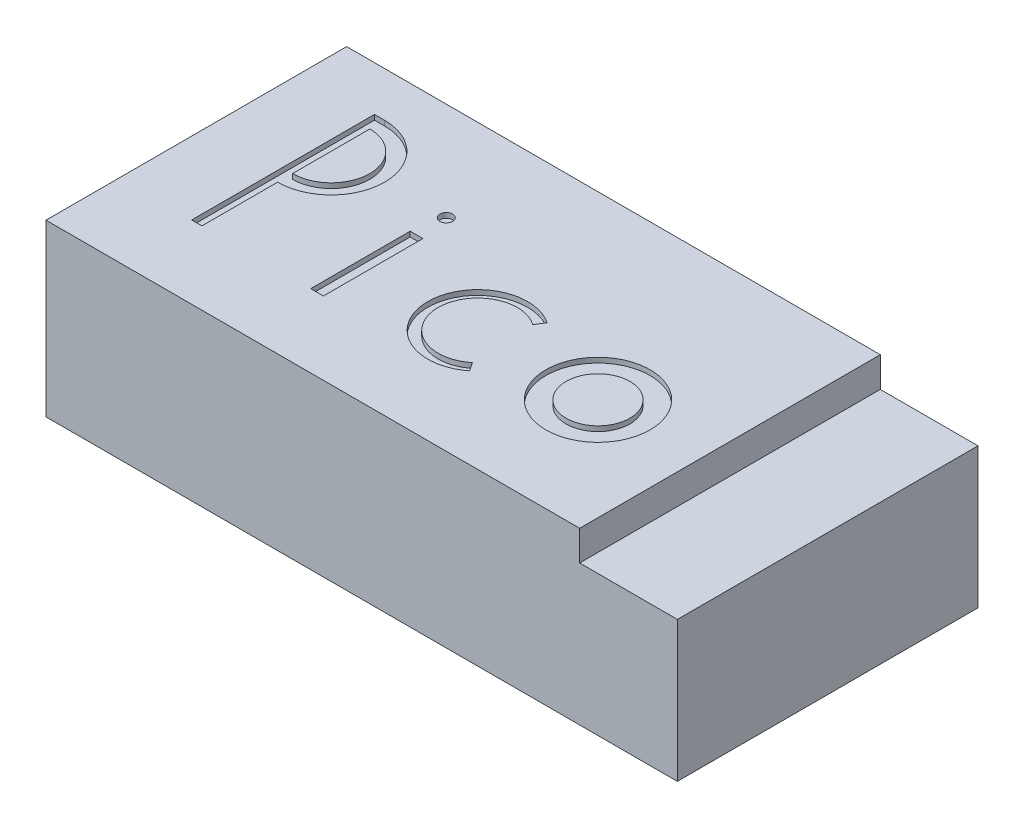
ISO-10303-21;
HEADER;
FILE_DESCRIPTION(('STEP AP214'),'2;1');
FILE_NAME('part.step','',(''),(''),'','','');
FILE_SCHEMA(('AUTOMOTIVE_DESIGN { 1 0 10303 214 1 1 1 1 }'));
ENDSEC;
DATA;
#1=APPLICATION_CONTEXT('core data for automotive mechanical design processes');
#2=APPLICATION_PROTOCOL_DEFINITION('international standard','automotive_design',2000,#1);
#3=PRODUCT_CONTEXT('',#1,'mechanical');
#4=PRODUCT('Part','Part','',(#3));
#5=PRODUCT_RELATED_PRODUCT_CATEGORY('part','',(#4));
#6=PRODUCT_DEFINITION_FORMATION('','',#4);
#7=PRODUCT_DEFINITION_CONTEXT('part definition',#1,'design');
#8=PRODUCT_DEFINITION('design','',#6,#7);
#9=PRODUCT_DEFINITION_SHAPE('','',#8);
#10=(LENGTH_UNIT() NAMED_UNIT(*) SI_UNIT(.MILLI.,.METRE.));
#11=(NAMED_UNIT(*) PLANE_ANGLE_UNIT() SI_UNIT($,.RADIAN.));
#12=(NAMED_UNIT(*) SI_UNIT($,.STERADIAN.) SOLID_ANGLE_UNIT());
#13=UNCERTAINTY_MEASURE_WITH_UNIT(LENGTH_MEASURE(1.E-05),#10,'distance_accuracy_value','');
#14=(GEOMETRIC_REPRESENTATION_CONTEXT(3) GLOBAL_UNCERTAINTY_ASSIGNED_CONTEXT((#13)) GLOBAL_UNIT_ASSIGNED_CONTEXT((#10,
#11,#12)) REPRESENTATION_CONTEXT('',''));
#15=CARTESIAN_POINT('',(0.,0.,0.));
#16=DIRECTION('',(0.,0.,1.));
#17=DIRECTION('',(1.,0.,0.));
#18=AXIS2_PLACEMENT_3D('',#15,#16,#17);
#19=CARTESIAN_POINT('',(0.,28.,-60.));
#20=DIRECTION('',(1.,0.,0.));
#21=DIRECTION('',(0.,0.,-1.));
#22=AXIS2_PLACEMENT_3D('',#19,#20,#21);
#23=PLANE('',#22);
#24=DIRECTION('',(0.,0.,1.));
#25=VECTOR('',#24,1.);
#26=CARTESIAN_POINT('',(0.,0.,-60.));
#27=LINE('',#26,#25);
#28=CARTESIAN_POINT('',(0.,0.,-60.));
#29=VERTEX_POINT('',#28);
#30=CARTESIAN_POINT('',(0.,0.,0.));
#31=VERTEX_POINT('',#30);
#32=EDGE_CURVE('E405',#29,#31,#27,.T.);
#33=ORIENTED_EDGE('',*,*,#32,.T.);
#34=DIRECTION('',(0.,-1.,0.));
#35=VECTOR('',#34,1.);
#36=CARTESIAN_POINT('',(0.,28.,0.));
#37=LINE('',#36,#35);
#38=CARTESIAN_POINT('',(0.,34.,0.));
#39=VERTEX_POINT('',#38);
#40=EDGE_CURVE('E11',#39,#31,#37,.T.);
#41=ORIENTED_EDGE('',*,*,#40,.F.);
#42=DIRECTION('',(0.,0.,1.));
#43=VECTOR('',#42,1.);
#44=CARTESIAN_POINT('',(0.,34.,-60.));
#45=LINE('',#44,#43);
#46=CARTESIAN_POINT('',(0.,34.,-60.));
#47=VERTEX_POINT('',#46);
#48=EDGE_CURVE('E380',#47,#39,#45,.T.);
#49=ORIENTED_EDGE('',*,*,#48,.F.);
#50=DIRECTION('',(0.,-1.,0.));
#51=VECTOR('',#50,1.);
#52=CARTESIAN_POINT('',(0.,28.,-60.));
#53=LINE('',#52,#51);
#54=EDGE_CURVE('E416',#47,#29,#53,.T.);
#55=ORIENTED_EDGE('',*,*,#54,.T.);
#56=EDGE_LOOP('',(#33,#41,#49,#55));
#57=FACE_BOUND('',#56,.T.);
#58=ADVANCED_FACE('F45',(#57),#23,.F.);
#59=CARTESIAN_POINT('',(0.,28.,0.));
#60=DIRECTION('',(0.,0.,-1.));
#61=DIRECTION('',(-1.,0.,0.));
#62=AXIS2_PLACEMENT_3D('',#59,#60,#61);
#63=PLANE('',#62);
#64=DIRECTION('',(1.,0.,0.));
#65=VECTOR('',#64,1.);
#66=CARTESIAN_POINT('',(0.,0.,0.));
#67=LINE('',#66,#65);
#68=CARTESIAN_POINT('',(126.,0.,0.));
#69=VERTEX_POINT('',#68);
#70=EDGE_CURVE('E420',#31,#69,#67,.T.);
#71=ORIENTED_EDGE('',*,*,#70,.T.);
#72=DIRECTION('',(0.,-1.,0.));
#73=VECTOR('',#72,1.);
#74=CARTESIAN_POINT('',(126.,28.,0.));
#75=LINE('',#74,#73);
#76=CARTESIAN_POINT('',(126.,28.,0.));
#77=VERTEX_POINT('',#76);
#78=EDGE_CURVE('E53',#77,#69,#75,.T.);
#79=ORIENTED_EDGE('',*,*,#78,.F.);
#80=DIRECTION('',(1.,0.,0.));
#81=VECTOR('',#80,1.);
#82=CARTESIAN_POINT('',(0.,28.,0.));
#83=LINE('',#82,#81);
#84=CARTESIAN_POINT('',(106.5,28.,0.));
#85=VERTEX_POINT('',#84);
#86=EDGE_CURVE('E406',#85,#77,#83,.T.);
#87=ORIENTED_EDGE('',*,*,#86,.F.);
#88=DIRECTION('',(0.,-1.,0.));
#89=VECTOR('',#88,1.);
#90=CARTESIAN_POINT('',(106.5,34.,0.));
#91=LINE('',#90,#89);
#92=CARTESIAN_POINT('',(106.5,34.,0.));
#93=VERTEX_POINT('',#92);
#94=EDGE_CURVE('E401',#93,#85,#91,.T.);
#95=ORIENTED_EDGE('',*,*,#94,.F.);
#96=DIRECTION('',(1.,0.,0.));
#97=VECTOR('',#96,1.);
#98=CARTESIAN_POINT('',(0.,34.,0.));
#99=LINE('',#98,#97);
#100=EDGE_CURVE('E384',#39,#93,#99,.T.);
#101=ORIENTED_EDGE('',*,*,#100,.F.);
#102=ORIENTED_EDGE('',*,*,#40,.T.);
#103=EDGE_LOOP('',(#71,#79,#87,#95,#101,#102));
#104=FACE_BOUND('',#103,.T.);
#105=ADVANCED_FACE('F464',(#104),#63,.F.);
#106=CARTESIAN_POINT('',(126.,28.,0.));
#107=DIRECTION('',(-1.,0.,0.));
#108=DIRECTION('',(0.,0.,1.));
#109=AXIS2_PLACEMENT_3D('',#106,#107,#108);
#110=PLANE('',#109);
#111=DIRECTION('',(0.,0.,-1.));
#112=VECTOR('',#111,1.);
#113=CARTESIAN_POINT('',(126.,0.,0.));
#114=LINE('',#113,#112);
#115=CARTESIAN_POINT('',(126.,0.,-60.));
#116=VERTEX_POINT('',#115);
#117=EDGE_CURVE('E423',#69,#116,#114,.T.);
#118=ORIENTED_EDGE('',*,*,#117,.T.);
#119=DIRECTION('',(0.,-1.,0.));
#120=VECTOR('',#119,1.);
#121=CARTESIAN_POINT('',(126.,28.,-60.));
#122=LINE('',#121,#120);
#123=CARTESIAN_POINT('',(126.,28.,-60.));
#124=VERTEX_POINT('',#123);
#125=EDGE_CURVE('E431',#124,#116,#122,.T.);
#126=ORIENTED_EDGE('',*,*,#125,.F.);
#127=DIRECTION('',(0.,0.,-1.));
#128=VECTOR('',#127,1.);
#129=CARTESIAN_POINT('',(126.,28.,0.));
#130=LINE('',#129,#128);
#131=EDGE_CURVE('E409',#77,#124,#130,.T.);
#132=ORIENTED_EDGE('',*,*,#131,.F.);
#133=ORIENTED_EDGE('',*,*,#78,.T.);
#134=EDGE_LOOP('',(#118,#126,#132,#133));
#135=FACE_BOUND('',#134,.T.);
#136=ADVANCED_FACE('F440',(#135),#110,.F.);
#137=CARTESIAN_POINT('',(126.,28.,-60.));
#138=DIRECTION('',(0.,0.,1.));
#139=DIRECTION('',(1.,0.,0.));
#140=AXIS2_PLACEMENT_3D('',#137,#138,#139);
#141=PLANE('',#140);
#142=DIRECTION('',(-1.,0.,0.));
#143=VECTOR('',#142,1.);
#144=CARTESIAN_POINT('',(126.,0.,-60.));
#145=LINE('',#144,#143);
#146=EDGE_CURVE('E410',#116,#29,#145,.T.);
#147=ORIENTED_EDGE('',*,*,#146,.T.);
#148=ORIENTED_EDGE('',*,*,#54,.F.);
#149=DIRECTION('',(-1.,0.,0.));
#150=VECTOR('',#149,1.);
#151=CARTESIAN_POINT('',(106.5,34.,-60.));
#152=LINE('',#151,#150);
#153=CARTESIAN_POINT('',(106.5,34.,-60.));
#154=VERTEX_POINT('',#153);
#155=EDGE_CURVE('E390',#154,#47,#152,.T.);
#156=ORIENTED_EDGE('',*,*,#155,.F.);
#157=DIRECTION('',(0.,-1.,0.));
#158=VECTOR('',#157,1.);
#159=CARTESIAN_POINT('',(106.5,34.,-60.));
#160=LINE('',#159,#158);
#161=CARTESIAN_POINT('',(106.5,28.,-60.));
#162=VERTEX_POINT('',#161);
#163=EDGE_CURVE('E394',#154,#162,#160,.T.);
#164=ORIENTED_EDGE('',*,*,#163,.T.);
#165=DIRECTION('',(-1.,0.,0.));
#166=VECTOR('',#165,1.);
#167=CARTESIAN_POINT('',(126.,28.,-60.));
#168=LINE('',#167,#166);
#169=EDGE_CURVE('E413',#124,#162,#168,.T.);
#170=ORIENTED_EDGE('',*,*,#169,.F.);
#171=ORIENTED_EDGE('',*,*,#125,.T.);
#172=EDGE_LOOP('',(#147,#148,#156,#164,#170,#171));
#173=FACE_BOUND('',#172,.T.);
#174=ADVANCED_FACE('F449',(#173),#141,.F.);
#175=CARTESIAN_POINT('',(0.,28.,0.));
#176=DIRECTION('',(0.,1.,0.));
#177=DIRECTION('',(0.,0.,1.));
#178=AXIS2_PLACEMENT_3D('',#175,#176,#177);
#179=PLANE('',#178);
#180=DIRECTION('',(0.,0.,-1.));
#181=VECTOR('',#180,1.);
#182=CARTESIAN_POINT('',(106.5,28.,0.));
#183=LINE('',#182,#181);
#184=EDGE_CURVE('E257',#85,#162,#183,.T.);
#185=ORIENTED_EDGE('',*,*,#184,.F.);
#186=ORIENTED_EDGE('',*,*,#86,.T.);
#187=ORIENTED_EDGE('',*,*,#131,.T.);
#188=ORIENTED_EDGE('',*,*,#169,.T.);
#189=EDGE_LOOP('',(#185,#186,#187,#188));
#190=FACE_BOUND('',#189,.T.);
#191=ADVANCED_FACE('F463',(#190),#179,.T.);
#192=CARTESIAN_POINT('',(0.,0.,0.));
#193=DIRECTION('',(0.,1.,0.));
#194=DIRECTION('',(0.,0.,1.));
#195=AXIS2_PLACEMENT_3D('',#192,#193,#194);
#196=PLANE('',#195);
#197=ORIENTED_EDGE('',*,*,#32,.F.);
#198=ORIENTED_EDGE('',*,*,#146,.F.);
#199=ORIENTED_EDGE('',*,*,#117,.F.);
#200=ORIENTED_EDGE('',*,*,#70,.F.);
#201=EDGE_LOOP('',(#197,#198,#199,#200));
#202=FACE_BOUND('',#201,.T.);
#203=ADVANCED_FACE('F447',(#202),#196,.F.);
#204=CARTESIAN_POINT('',(106.5,34.,0.));
#205=DIRECTION('',(-1.,0.,0.));
#206=DIRECTION('',(0.,0.,1.));
#207=AXIS2_PLACEMENT_3D('',#204,#205,#206);
#208=PLANE('',#207);
#209=ORIENTED_EDGE('',*,*,#184,.T.);
#210=ORIENTED_EDGE('',*,*,#163,.F.);
#211=DIRECTION('',(0.,0.,-1.));
#212=VECTOR('',#211,1.);
#213=CARTESIAN_POINT('',(106.5,34.,0.));
#214=LINE('',#213,#212);
#215=EDGE_CURVE('E387',#93,#154,#214,.T.);
#216=ORIENTED_EDGE('',*,*,#215,.F.);
#217=ORIENTED_EDGE('',*,*,#94,.T.);
#218=EDGE_LOOP('',(#209,#210,#216,#217));
#219=FACE_BOUND('',#218,.T.);
#220=ADVANCED_FACE('F461',(#219),#208,.F.);
#221=CARTESIAN_POINT('',(0.,34.,0.));
#222=DIRECTION('',(0.,1.,0.));
#223=DIRECTION('',(0.,0.,1.));
#224=AXIS2_PLACEMENT_3D('',#221,#222,#223);
#225=PLANE('',#224);
#226=DIRECTION('',(-1.,0.,0.));
#227=VECTOR('',#226,1.);
#228=CARTESIAN_POINT('',(14.4991343751467,34.,-51.0511672698902));
#229=LINE('',#228,#227);
#230=CARTESIAN_POINT('',(16.5466643223701,34.,-51.0511672698902));
#231=VERTEX_POINT('',#230);
#232=CARTESIAN_POINT('',(14.4991343751467,34.,-51.0511672698902));
#233=VERTEX_POINT('',#232);
#234=EDGE_CURVE('E60',#231,#233,#229,.T.);
#235=ORIENTED_EDGE('',*,*,#234,.F.);
#236=CARTESIAN_POINT('',(16.5466643223701,34.,-40.3656203578184));
#237=DIRECTION('',(0.,1.,0.));
#238=DIRECTION('',(0.,0.,1.));
#239=AXIS2_PLACEMENT_3D('',#236,#237,#238);
#240=CIRCLE('',#239,10.6855469120719);
#241=CARTESIAN_POINT('',(16.5466643223701,34.,-29.6800734457465));
#242=VERTEX_POINT('',#241);
#243=EDGE_CURVE('E248',#242,#231,#240,.T.);
#244=ORIENTED_EDGE('',*,*,#243,.F.);
#245=DIRECTION('',(0.,0.,-1.));
#246=VECTOR('',#245,1.);
#247=CARTESIAN_POINT('',(16.5466643223701,34.,-14.5795400849742));
#248=LINE('',#247,#246);
#249=CARTESIAN_POINT('',(16.5466643223701,34.,-14.5795400849742));
#250=VERTEX_POINT('',#249);
#251=EDGE_CURVE('E244',#250,#242,#248,.T.);
#252=ORIENTED_EDGE('',*,*,#251,.F.);
#253=DIRECTION('',(1.,0.,0.));
#254=VECTOR('',#253,1.);
#255=CARTESIAN_POINT('',(14.4991343751467,34.,-14.5795400849742));
#256=LINE('',#255,#254);
#257=CARTESIAN_POINT('',(14.4991343751467,34.,-14.5795400849742));
#258=VERTEX_POINT('',#257);
#259=EDGE_CURVE('E240',#258,#250,#256,.T.);
#260=ORIENTED_EDGE('',*,*,#259,.F.);
#261=DIRECTION('',(0.,0.,1.));
#262=VECTOR('',#261,1.);
#263=CARTESIAN_POINT('',(14.4991343751467,34.,-40.4296056686691));
#264=LINE('',#263,#262);
#265=EDGE_CURVE('E215',#233,#258,#264,.T.);
#266=ORIENTED_EDGE('',*,*,#265,.F.);
#267=EDGE_LOOP('',(#235,#244,#252,#260,#266));
#268=FACE_BOUND('',#267,.T.);
#269=CARTESIAN_POINT('',(39.5171071196558,34.,-40.3656203578184));
#270=DIRECTION('',(0.,1.,0.));
#271=DIRECTION('',(0.,0.,1.));
#272=AXIS2_PLACEMENT_3D('',#269,#270,#271);
#273=CIRCLE('',#272,1.27083711669992);
#274=CARTESIAN_POINT('',(39.5171071196558,34.,-39.0947832411184));
#275=VERTEX_POINT('',#274);
#276=EDGE_CURVE('E212',#275,#275,#273,.T.);
#277=ORIENTED_EDGE('',*,*,#276,.F.);
#278=EDGE_LOOP('',(#277));
#279=FACE_BOUND('',#278,.T.);
#280=DIRECTION('',(-1.,0.,0.));
#281=VECTOR('',#280,1.);
#282=CARTESIAN_POINT('',(40.7879442363557,34.,-34.4351567888179));
#283=LINE('',#282,#281);
#284=CARTESIAN_POINT('',(40.7879442363557,34.,-34.4351567888179));
#285=VERTEX_POINT('',#284);
#286=CARTESIAN_POINT('',(38.2462700029558,34.,-34.4351567888179));
#287=VERTEX_POINT('',#286);
#288=EDGE_CURVE('E276',#285,#287,#283,.T.);
#289=ORIENTED_EDGE('',*,*,#288,.F.);
#290=DIRECTION('',(0.,0.,-1.));
#291=VECTOR('',#290,1.);
#292=CARTESIAN_POINT('',(40.7879442363557,34.,-14.5795400849742));
#293=LINE('',#292,#291);
#294=CARTESIAN_POINT('',(40.7879442363557,34.,-14.5795400849742));
#295=VERTEX_POINT('',#294);
#296=EDGE_CURVE('E292',#295,#285,#293,.T.);
#297=ORIENTED_EDGE('',*,*,#296,.F.);
#298=DIRECTION('',(1.,0.,0.));
#299=VECTOR('',#298,1.);
#300=CARTESIAN_POINT('',(38.2462700029558,34.,-14.5795400849742));
#301=LINE('',#300,#299);
#302=CARTESIAN_POINT('',(38.2462700029558,34.,-14.5795400849742));
#303=VERTEX_POINT('',#302);
#304=EDGE_CURVE('E296',#303,#295,#301,.T.);
#305=ORIENTED_EDGE('',*,*,#304,.F.);
#306=DIRECTION('',(0.,0.,1.));
#307=VECTOR('',#306,1.);
#308=CARTESIAN_POINT('',(38.2462700029558,34.,-34.4351567888179));
#309=LINE('',#308,#307);
#310=EDGE_CURVE('E301',#287,#303,#309,.T.);
#311=ORIENTED_EDGE('',*,*,#310,.F.);
#312=EDGE_LOOP('',(#289,#297,#305,#311));
#313=FACE_BOUND('',#312,.T.);
#314=CARTESIAN_POINT('',(62.1211898275485,34.,-24.0332780205841));
#315=DIRECTION('',(0.,1.,0.));
#316=DIRECTION('',(0.,0.,-1.));
#317=AXIS2_PLACEMENT_3D('',#314,#315,#316);
#318=CIRCLE('',#317,9.96573495840507);
#319=CARTESIAN_POINT('',(67.7414821198603,34.,-32.2629917343263));
#320=VERTEX_POINT('',#319);
#321=CARTESIAN_POINT('',(68.3223098624572,34.,-16.2318689444087));
#322=VERTEX_POINT('',#321);
#323=EDGE_CURVE('E291',#320,#322,#318,.T.);
#324=ORIENTED_EDGE('',*,*,#323,.F.);
#325=DIRECTION('',(0.543597833245931,0.,-0.839345814125697));
#326=VECTOR('',#325,1.);
#327=CARTESIAN_POINT('',(67.7414821198603,34.,-32.2629917343263));
#328=LINE('',#327,#326);
#329=CARTESIAN_POINT('',(66.6220027561112,34.,-30.5344522507302));
#330=VERTEX_POINT('',#329);
#331=EDGE_CURVE('E336',#330,#320,#328,.T.);
#332=ORIENTED_EDGE('',*,*,#331,.F.);
#333=CARTESIAN_POINT('',(62.1211898275485,34.,-24.0332780205841));
#334=DIRECTION('',(0.,-1.,0.));
#335=DIRECTION('',(0.,0.,1.));
#336=AXIS2_PLACEMENT_3D('',#333,#334,#335);
#337=CIRCLE('',#336,7.90712232032828);
#338=CARTESIAN_POINT('',(67.166075126684,34.,-17.9446233492137));
#339=VERTEX_POINT('',#338);
#340=EDGE_CURVE('E340',#339,#330,#337,.T.);
#341=ORIENTED_EDGE('',*,*,#340,.F.);
#342=DIRECTION('',(-0.55951457992888,0.,-0.828820508220573));
#343=VECTOR('',#342,1.);
#344=CARTESIAN_POINT('',(67.166075126684,34.,-17.9446233492137));
#345=LINE('',#344,#343);
#346=EDGE_CURVE('E345',#322,#339,#345,.T.);
#347=ORIENTED_EDGE('',*,*,#346,.F.);
#348=EDGE_LOOP('',(#324,#332,#341,#347));
#349=FACE_BOUND('',#348,.T.);
#350=CARTESIAN_POINT('',(86.1255254465497,34.,-24.0332780205841));
#351=DIRECTION('',(0.,1.,0.));
#352=DIRECTION('',(0.,0.,1.));
#353=AXIS2_PLACEMENT_3D('',#350,#351,#352);
#354=CIRCLE('',#353,10.4018787682338);
#355=CARTESIAN_POINT('',(86.1255254465497,34.,-13.6313992523502));
#356=VERTEX_POINT('',#355);
#357=EDGE_CURVE('E365',#356,#356,#354,.T.);
#358=ORIENTED_EDGE('',*,*,#357,.F.);
#359=EDGE_LOOP('',(#358));
#360=FACE_BOUND('',#359,.T.);
#361=ORIENTED_EDGE('',*,*,#48,.T.);
#362=ORIENTED_EDGE('',*,*,#100,.T.);
#363=ORIENTED_EDGE('',*,*,#215,.T.);
#364=ORIENTED_EDGE('',*,*,#155,.T.);
#365=EDGE_LOOP('',(#361,#362,#363,#364));
#366=FACE_BOUND('',#365,.T.);
#367=ADVANCED_FACE('F456',(#268,#279,#313,#349,#360,#366),#225,.T.);
#368=CARTESIAN_POINT('',(86.1255254465497,33.,-24.0332780205841));
#369=DIRECTION('',(0.,1.,0.));
#370=DIRECTION('',(0.,0.,1.));
#371=AXIS2_PLACEMENT_3D('',#368,#369,#370);
#372=CYLINDRICAL_SURFACE('',#371,10.4018787682338);
#373=CARTESIAN_POINT('',(86.1255254465497,33.,-24.0332780205841));
#374=DIRECTION('',(0.,1.,0.));
#375=DIRECTION('',(0.,0.,1.));
#376=AXIS2_PLACEMENT_3D('',#373,#374,#375);
#377=CIRCLE('',#376,10.4018787682338);
#378=CARTESIAN_POINT('',(86.1255254465497,33.,-13.6313992523502));
#379=VERTEX_POINT('',#378);
#380=EDGE_CURVE('E370',#379,#379,#377,.T.);
#381=ORIENTED_EDGE('',*,*,#380,.F.);
#382=EDGE_LOOP('',(#381));
#383=FACE_BOUND('',#382,.T.);
#384=ORIENTED_EDGE('',*,*,#357,.T.);
#385=EDGE_LOOP('',(#384));
#386=FACE_BOUND('',#385,.T.);
#387=ADVANCED_FACE('F482',(#383,#386),#372,.F.);
#388=CARTESIAN_POINT('',(86.1255254465497,33.,-24.0332780205841));
#389=DIRECTION('',(0.,1.,0.));
#390=DIRECTION('',(0.,0.,1.));
#391=AXIS2_PLACEMENT_3D('',#388,#389,#390);
#392=PLANE('',#391);
#393=CARTESIAN_POINT('',(86.1255254465497,33.,-24.0332780205841));
#394=DIRECTION('',(0.,1.,0.));
#395=DIRECTION('',(0.,0.,1.));
#396=AXIS2_PLACEMENT_3D('',#393,#394,#395);
#397=CIRCLE('',#396,6.36668212356475);
#398=CARTESIAN_POINT('',(86.1255254465497,33.,-17.6665958970193));
#399=VERTEX_POINT('',#398);
#400=EDGE_CURVE('E369',#399,#399,#397,.T.);
#401=ORIENTED_EDGE('',*,*,#400,.F.);
#402=EDGE_LOOP('',(#401));
#403=FACE_BOUND('',#402,.T.);
#404=ORIENTED_EDGE('',*,*,#380,.T.);
#405=EDGE_LOOP('',(#404));
#406=FACE_BOUND('',#405,.T.);
#407=ADVANCED_FACE('F490',(#403,#406),#392,.T.);
#408=CARTESIAN_POINT('',(86.1255254465497,33.,-24.0332780205841));
#409=DIRECTION('',(0.,1.,0.));
#410=DIRECTION('',(0.,0.,1.));
#411=AXIS2_PLACEMENT_3D('',#408,#409,#410);
#412=CYLINDRICAL_SURFACE('',#411,6.36668212356475);
#413=ORIENTED_EDGE('',*,*,#400,.T.);
#414=EDGE_LOOP('',(#413));
#415=FACE_BOUND('',#414,.T.);
#416=CARTESIAN_POINT('',(86.1255254465497,34.,-24.0332780205841));
#417=DIRECTION('',(0.,1.,0.));
#418=DIRECTION('',(0.,0.,1.));
#419=AXIS2_PLACEMENT_3D('',#416,#417,#418);
#420=CIRCLE('',#419,6.36668212356475);
#421=CARTESIAN_POINT('',(86.1255254465497,34.,-17.6665958970193));
#422=VERTEX_POINT('',#421);
#423=EDGE_CURVE('E335',#422,#422,#420,.T.);
#424=ORIENTED_EDGE('',*,*,#423,.F.);
#425=EDGE_LOOP('',(#424));
#426=FACE_BOUND('',#425,.T.);
#427=ADVANCED_FACE('F486',(#415,#426),#412,.T.);
#428=CARTESIAN_POINT('',(62.1211898275485,33.,-24.0332780205841));
#429=DIRECTION('',(0.,1.,0.));
#430=DIRECTION('',(0.,0.,1.));
#431=AXIS2_PLACEMENT_3D('',#428,#429,#430);
#432=CYLINDRICAL_SURFACE('',#431,9.96573495840507);
#433=ORIENTED_EDGE('',*,*,#323,.T.);
#434=DIRECTION('',(0.,1.,0.));
#435=VECTOR('',#434,1.);
#436=CARTESIAN_POINT('',(68.3223098624572,33.,-16.2318689444087));
#437=LINE('',#436,#435);
#438=CARTESIAN_POINT('',(68.3223098624572,33.,-16.2318689444087));
#439=VERTEX_POINT('',#438);
#440=EDGE_CURVE('E321',#439,#322,#437,.T.);
#441=ORIENTED_EDGE('',*,*,#440,.F.);
#442=CARTESIAN_POINT('',(62.1211898275485,33.,-24.0332780205841));
#443=DIRECTION('',(0.,1.,0.));
#444=DIRECTION('',(0.,0.,-1.));
#445=AXIS2_PLACEMENT_3D('',#442,#443,#444);
#446=CIRCLE('',#445,9.96573495840507);
#447=CARTESIAN_POINT('',(67.7414821198603,33.,-32.2629917343263));
#448=VERTEX_POINT('',#447);
#449=EDGE_CURVE('E341',#448,#439,#446,.T.);
#450=ORIENTED_EDGE('',*,*,#449,.F.);
#451=DIRECTION('',(0.,1.,0.));
#452=VECTOR('',#451,1.);
#453=CARTESIAN_POINT('',(67.7414821198603,33.,-32.2629917343263));
#454=LINE('',#453,#452);
#455=EDGE_CURVE('E332',#448,#320,#454,.T.);
#456=ORIENTED_EDGE('',*,*,#455,.T.);
#457=EDGE_LOOP('',(#433,#441,#450,#456));
#458=FACE_BOUND('',#457,.T.);
#459=ADVANCED_FACE('F489',(#458),#432,.F.);
#460=CARTESIAN_POINT('',(67.7414821198603,33.,-32.2629917343263));
#461=DIRECTION('',(0.839345814125697,0.,0.543597833245931));
#462=DIRECTION('',(0.543597833245931,0.,-0.839345814125697));
#463=AXIS2_PLACEMENT_3D('',#460,#461,#462);
#464=PLANE('',#463);
#465=ORIENTED_EDGE('',*,*,#331,.T.);
#466=ORIENTED_EDGE('',*,*,#455,.F.);
#467=DIRECTION('',(0.543597833245931,0.,-0.839345814125697));
#468=VECTOR('',#467,1.);
#469=CARTESIAN_POINT('',(67.7414821198603,33.,-32.2629917343263));
#470=LINE('',#469,#468);
#471=CARTESIAN_POINT('',(66.6220027561112,33.,-30.5344522507302));
#472=VERTEX_POINT('',#471);
#473=EDGE_CURVE('E325',#472,#448,#470,.T.);
#474=ORIENTED_EDGE('',*,*,#473,.F.);
#475=DIRECTION('',(0.,1.,0.));
#476=VECTOR('',#475,1.);
#477=CARTESIAN_POINT('',(66.6220027561112,33.,-30.5344522507302));
#478=LINE('',#477,#476);
#479=EDGE_CURVE('E329',#472,#330,#478,.T.);
#480=ORIENTED_EDGE('',*,*,#479,.T.);
#481=EDGE_LOOP('',(#465,#466,#474,#480));
#482=FACE_BOUND('',#481,.T.);
#483=ADVANCED_FACE('F504',(#482),#464,.F.);
#484=CARTESIAN_POINT('',(62.1211898275485,33.,-24.0332780205841));
#485=DIRECTION('',(0.,1.,0.));
#486=DIRECTION('',(0.,0.,1.));
#487=AXIS2_PLACEMENT_3D('',#484,#485,#486);
#488=CYLINDRICAL_SURFACE('',#487,7.90712232032828);
#489=ORIENTED_EDGE('',*,*,#340,.T.);
#490=ORIENTED_EDGE('',*,*,#479,.F.);
#491=CARTESIAN_POINT('',(62.1211898275485,33.,-24.0332780205841));
#492=DIRECTION('',(0.,-1.,0.));
#493=DIRECTION('',(0.,0.,1.));
#494=AXIS2_PLACEMENT_3D('',#491,#492,#493);
#495=CIRCLE('',#494,7.90712232032828);
#496=CARTESIAN_POINT('',(67.166075126684,33.,-17.9446233492137));
#497=VERTEX_POINT('',#496);
#498=EDGE_CURVE('E354',#497,#472,#495,.T.);
#499=ORIENTED_EDGE('',*,*,#498,.F.);
#500=DIRECTION('',(0.,1.,0.));
#501=VECTOR('',#500,1.);
#502=CARTESIAN_POINT('',(67.166075126684,33.,-17.9446233492137));
#503=LINE('',#502,#501);
#504=EDGE_CURVE('E326',#497,#339,#503,.T.);
#505=ORIENTED_EDGE('',*,*,#504,.T.);
#506=EDGE_LOOP('',(#489,#490,#499,#505));
#507=FACE_BOUND('',#506,.T.);
#508=ADVANCED_FACE('F507',(#507),#488,.T.);
#509=CARTESIAN_POINT('',(67.166075126684,33.,-17.9446233492137));
#510=DIRECTION('',(0.828820508220573,0.,-0.55951457992888));
#511=DIRECTION('',(-0.55951457992888,0.,-0.828820508220573));
#512=AXIS2_PLACEMENT_3D('',#509,#510,#511);
#513=PLANE('',#512);
#514=ORIENTED_EDGE('',*,*,#346,.T.);
#515=ORIENTED_EDGE('',*,*,#504,.F.);
#516=DIRECTION('',(-0.55951457992888,0.,-0.828820508220573));
#517=VECTOR('',#516,1.);
#518=CARTESIAN_POINT('',(67.166075126684,33.,-17.9446233492137));
#519=LINE('',#518,#517);
#520=EDGE_CURVE('E358',#439,#497,#519,.T.);
#521=ORIENTED_EDGE('',*,*,#520,.F.);
#522=ORIENTED_EDGE('',*,*,#440,.T.);
#523=EDGE_LOOP('',(#514,#515,#521,#522));
#524=FACE_BOUND('',#523,.T.);
#525=ADVANCED_FACE('F502',(#524),#513,.F.);
#526=CARTESIAN_POINT('',(62.1211898275485,33.,-24.0332780205841));
#527=DIRECTION('',(0.,-1.,0.));
#528=DIRECTION('',(0.,0.,-1.));
#529=AXIS2_PLACEMENT_3D('',#526,#527,#528);
#530=PLANE('',#529);
#531=ORIENTED_EDGE('',*,*,#449,.T.);
#532=ORIENTED_EDGE('',*,*,#520,.T.);
#533=ORIENTED_EDGE('',*,*,#498,.T.);
#534=ORIENTED_EDGE('',*,*,#473,.T.);
#535=EDGE_LOOP('',(#531,#532,#533,#534));
#536=FACE_BOUND('',#535,.T.);
#537=ADVANCED_FACE('F498',(#536),#530,.F.);
#538=CARTESIAN_POINT('',(40.7879442363557,33.,-34.4351567888179));
#539=DIRECTION('',(0.,0.,-1.));
#540=DIRECTION('',(-1.,0.,0.));
#541=AXIS2_PLACEMENT_3D('',#538,#539,#540);
#542=PLANE('',#541);
#543=ORIENTED_EDGE('',*,*,#288,.T.);
#544=DIRECTION('',(0.,1.,0.));
#545=VECTOR('',#544,1.);
#546=CARTESIAN_POINT('',(38.2462700029558,33.,-34.4351567888179));
#547=LINE('',#546,#545);
#548=CARTESIAN_POINT('',(38.2462700029558,33.,-34.4351567888179));
#549=VERTEX_POINT('',#548);
#550=EDGE_CURVE('E277',#549,#287,#547,.T.);
#551=ORIENTED_EDGE('',*,*,#550,.F.);
#552=DIRECTION('',(-1.,0.,0.));
#553=VECTOR('',#552,1.);
#554=CARTESIAN_POINT('',(40.7879442363557,33.,-34.4351567888179));
#555=LINE('',#554,#553);
#556=CARTESIAN_POINT('',(40.7879442363557,33.,-34.4351567888179));
#557=VERTEX_POINT('',#556);
#558=EDGE_CURVE('E297',#557,#549,#555,.T.);
#559=ORIENTED_EDGE('',*,*,#558,.F.);
#560=DIRECTION('',(0.,1.,0.));
#561=VECTOR('',#560,1.);
#562=CARTESIAN_POINT('',(40.7879442363557,33.,-34.4351567888179));
#563=LINE('',#562,#561);
#564=EDGE_CURVE('E288',#557,#285,#563,.T.);
#565=ORIENTED_EDGE('',*,*,#564,.T.);
#566=EDGE_LOOP('',(#543,#551,#559,#565));
#567=FACE_BOUND('',#566,.T.);
#568=ADVANCED_FACE('F501',(#567),#542,.F.);
#569=CARTESIAN_POINT('',(40.7879442363557,33.,-14.5795400849742));
#570=DIRECTION('',(1.,0.,0.));
#571=DIRECTION('',(0.,0.,-1.));
#572=AXIS2_PLACEMENT_3D('',#569,#570,#571);
#573=PLANE('',#572);
#574=ORIENTED_EDGE('',*,*,#296,.T.);
#575=ORIENTED_EDGE('',*,*,#564,.F.);
#576=DIRECTION('',(0.,0.,-1.));
#577=VECTOR('',#576,1.);
#578=CARTESIAN_POINT('',(40.7879442363557,33.,-14.5795400849742));
#579=LINE('',#578,#577);
#580=CARTESIAN_POINT('',(40.7879442363557,33.,-14.5795400849742));
#581=VERTEX_POINT('',#580);
#582=EDGE_CURVE('E281',#581,#557,#579,.T.);
#583=ORIENTED_EDGE('',*,*,#582,.F.);
#584=DIRECTION('',(0.,1.,0.));
#585=VECTOR('',#584,1.);
#586=CARTESIAN_POINT('',(40.7879442363557,33.,-14.5795400849742));
#587=LINE('',#586,#585);
#588=EDGE_CURVE('E285',#581,#295,#587,.T.);
#589=ORIENTED_EDGE('',*,*,#588,.T.);
#590=EDGE_LOOP('',(#574,#575,#583,#589));
#591=FACE_BOUND('',#590,.T.);
#592=ADVANCED_FACE('F524',(#591),#573,.F.);
#593=CARTESIAN_POINT('',(38.2462700029558,33.,-14.5795400849742));
#594=DIRECTION('',(0.,0.,1.));
#595=DIRECTION('',(1.,0.,0.));
#596=AXIS2_PLACEMENT_3D('',#593,#594,#595);
#597=PLANE('',#596);
#598=ORIENTED_EDGE('',*,*,#304,.T.);
#599=ORIENTED_EDGE('',*,*,#588,.F.);
#600=DIRECTION('',(1.,0.,0.));
#601=VECTOR('',#600,1.);
#602=CARTESIAN_POINT('',(38.2462700029558,33.,-14.5795400849742));
#603=LINE('',#602,#601);
#604=CARTESIAN_POINT('',(38.2462700029558,33.,-14.5795400849742));
#605=VERTEX_POINT('',#604);
#606=EDGE_CURVE('E310',#605,#581,#603,.T.);
#607=ORIENTED_EDGE('',*,*,#606,.F.);
#608=DIRECTION('',(0.,1.,0.));
#609=VECTOR('',#608,1.);
#610=CARTESIAN_POINT('',(38.2462700029558,33.,-14.5795400849742));
#611=LINE('',#610,#609);
#612=EDGE_CURVE('E282',#605,#303,#611,.T.);
#613=ORIENTED_EDGE('',*,*,#612,.T.);
#614=EDGE_LOOP('',(#598,#599,#607,#613));
#615=FACE_BOUND('',#614,.T.);
#616=ADVANCED_FACE('F527',(#615),#597,.F.);
#617=CARTESIAN_POINT('',(38.2462700029558,33.,-34.4351567888179));
#618=DIRECTION('',(-1.,0.,0.));
#619=DIRECTION('',(0.,0.,1.));
#620=AXIS2_PLACEMENT_3D('',#617,#618,#619);
#621=PLANE('',#620);
#622=ORIENTED_EDGE('',*,*,#310,.T.);
#623=ORIENTED_EDGE('',*,*,#612,.F.);
#624=DIRECTION('',(0.,0.,1.));
#625=VECTOR('',#624,1.);
#626=CARTESIAN_POINT('',(38.2462700029558,33.,-34.4351567888179));
#627=LINE('',#626,#625);
#628=EDGE_CURVE('E314',#549,#605,#627,.T.);
#629=ORIENTED_EDGE('',*,*,#628,.F.);
#630=ORIENTED_EDGE('',*,*,#550,.T.);
#631=EDGE_LOOP('',(#622,#623,#629,#630));
#632=FACE_BOUND('',#631,.T.);
#633=ADVANCED_FACE('F522',(#632),#621,.F.);
#634=CARTESIAN_POINT('',(0.,33.,0.));
#635=DIRECTION('',(0.,1.,0.));
#636=DIRECTION('',(0.,0.,1.));
#637=AXIS2_PLACEMENT_3D('',#634,#635,#636);
#638=PLANE('',#637);
#639=ORIENTED_EDGE('',*,*,#558,.T.);
#640=ORIENTED_EDGE('',*,*,#628,.T.);
#641=ORIENTED_EDGE('',*,*,#606,.T.);
#642=ORIENTED_EDGE('',*,*,#582,.T.);
#643=EDGE_LOOP('',(#639,#640,#641,#642));
#644=FACE_BOUND('',#643,.T.);
#645=ADVANCED_FACE('F518',(#644),#638,.T.);
#646=CARTESIAN_POINT('',(39.5171071196558,33.,-40.3656203578184));
#647=DIRECTION('',(0.,1.,0.));
#648=DIRECTION('',(0.,0.,1.));
#649=AXIS2_PLACEMENT_3D('',#646,#647,#648);
#650=CYLINDRICAL_SURFACE('',#649,1.27083711669992);
#651=CARTESIAN_POINT('',(39.5171071196558,33.,-40.3656203578184));
#652=DIRECTION('',(0.,1.,0.));
#653=DIRECTION('',(0.,0.,1.));
#654=AXIS2_PLACEMENT_3D('',#651,#652,#653);
#655=CIRCLE('',#654,1.27083711669992);
#656=CARTESIAN_POINT('',(39.5171071196558,33.,-39.0947832411184));
#657=VERTEX_POINT('',#656);
#658=EDGE_CURVE('E272',#657,#657,#655,.T.);
#659=ORIENTED_EDGE('',*,*,#658,.F.);
#660=EDGE_LOOP('',(#659));
#661=FACE_BOUND('',#660,.T.);
#662=ORIENTED_EDGE('',*,*,#276,.T.);
#663=EDGE_LOOP('',(#662));
#664=FACE_BOUND('',#663,.T.);
#665=ADVANCED_FACE('F521',(#661,#664),#650,.F.);
#666=CARTESIAN_POINT('',(39.5171071196558,33.,-40.3656203578184));
#667=DIRECTION('',(0.,1.,0.));
#668=DIRECTION('',(0.,0.,1.));
#669=AXIS2_PLACEMENT_3D('',#666,#667,#668);
#670=PLANE('',#669);
#671=ORIENTED_EDGE('',*,*,#658,.T.);
#672=EDGE_LOOP('',(#671));
#673=FACE_BOUND('',#672,.T.);
#674=ADVANCED_FACE('F538',(#673),#670,.T.);
#675=CARTESIAN_POINT('',(14.4991343751467,33.,-51.0511672698902));
#676=DIRECTION('',(0.,0.,-1.));
#677=DIRECTION('',(-1.,0.,0.));
#678=AXIS2_PLACEMENT_3D('',#675,#676,#677);
#679=PLANE('',#678);
#680=ORIENTED_EDGE('',*,*,#234,.T.);
#681=DIRECTION('',(0.,1.,0.));
#682=VECTOR('',#681,1.);
#683=CARTESIAN_POINT('',(14.4991343751467,33.,-51.0511672698902));
#684=LINE('',#683,#682);
#685=CARTESIAN_POINT('',(14.4991343751467,33.,-51.0511672698902));
#686=VERTEX_POINT('',#685);
#687=EDGE_CURVE('E254',#686,#233,#684,.T.);
#688=ORIENTED_EDGE('',*,*,#687,.F.);
#689=DIRECTION('',(-1.,0.,0.));
#690=VECTOR('',#689,1.);
#691=CARTESIAN_POINT('',(14.4991343751467,33.,-51.0511672698902));
#692=LINE('',#691,#690);
#693=CARTESIAN_POINT('',(16.5466643223701,33.,-51.0511672698902));
#694=VERTEX_POINT('',#693);
#695=EDGE_CURVE('E232',#694,#686,#692,.T.);
#696=ORIENTED_EDGE('',*,*,#695,.F.);
#697=DIRECTION('',(0.,1.,0.));
#698=VECTOR('',#697,1.);
#699=CARTESIAN_POINT('',(16.5466643223701,33.,-51.0511672698902));
#700=LINE('',#699,#698);
#701=EDGE_CURVE('E258',#694,#231,#700,.T.);
#702=ORIENTED_EDGE('',*,*,#701,.T.);
#703=EDGE_LOOP('',(#680,#688,#696,#702));
#704=FACE_BOUND('',#703,.T.);
#705=ADVANCED_FACE('F541',(#704),#679,.F.);
#706=CARTESIAN_POINT('',(16.5466643223701,33.,-40.3656203578184));
#707=DIRECTION('',(0.,1.,0.));
#708=DIRECTION('',(0.,0.,1.));
#709=AXIS2_PLACEMENT_3D('',#706,#707,#708);
#710=CYLINDRICAL_SURFACE('',#709,10.6855469120719);
#711=ORIENTED_EDGE('',*,*,#243,.T.);
#712=ORIENTED_EDGE('',*,*,#701,.F.);
#713=CARTESIAN_POINT('',(16.5466643223701,33.,-40.3656203578184));
#714=DIRECTION('',(0.,1.,0.));
#715=DIRECTION('',(0.,0.,1.));
#716=AXIS2_PLACEMENT_3D('',#713,#714,#715);
#717=CIRCLE('',#716,10.6855469120719);
#718=CARTESIAN_POINT('',(16.5466643223701,33.,-29.6800734457465));
#719=VERTEX_POINT('',#718);
#720=EDGE_CURVE('E228',#719,#694,#717,.T.);
#721=ORIENTED_EDGE('',*,*,#720,.F.);
#722=DIRECTION('',(0.,1.,0.));
#723=VECTOR('',#722,1.);
#724=CARTESIAN_POINT('',(16.5466643223701,33.,-29.6800734457465));
#725=LINE('',#724,#723);
#726=EDGE_CURVE('E261',#719,#242,#725,.T.);
#727=ORIENTED_EDGE('',*,*,#726,.T.);
#728=EDGE_LOOP('',(#711,#712,#721,#727));
#729=FACE_BOUND('',#728,.T.);
#730=ADVANCED_FACE('F557',(#729),#710,.F.);
#731=CARTESIAN_POINT('',(16.5466643223701,33.,-14.5795400849742));
#732=DIRECTION('',(1.,0.,0.));
#733=DIRECTION('',(0.,0.,-1.));
#734=AXIS2_PLACEMENT_3D('',#731,#732,#733);
#735=PLANE('',#734);
#736=ORIENTED_EDGE('',*,*,#251,.T.);
#737=ORIENTED_EDGE('',*,*,#726,.F.);
#738=DIRECTION('',(0.,0.,-1.));
#739=VECTOR('',#738,1.);
#740=CARTESIAN_POINT('',(16.5466643223701,33.,-14.5795400849742));
#741=LINE('',#740,#739);
#742=CARTESIAN_POINT('',(16.5466643223701,33.,-14.5795400849742));
#743=VERTEX_POINT('',#742);
#744=EDGE_CURVE('E224',#743,#719,#741,.T.);
#745=ORIENTED_EDGE('',*,*,#744,.F.);
#746=DIRECTION('',(0.,1.,0.));
#747=VECTOR('',#746,1.);
#748=CARTESIAN_POINT('',(16.5466643223701,33.,-14.5795400849742));
#749=LINE('',#748,#747);
#750=EDGE_CURVE('E264',#743,#250,#749,.T.);
#751=ORIENTED_EDGE('',*,*,#750,.T.);
#752=EDGE_LOOP('',(#736,#737,#745,#751));
#753=FACE_BOUND('',#752,.T.);
#754=ADVANCED_FACE('F553',(#753),#735,.F.);
#755=CARTESIAN_POINT('',(14.4991343751467,33.,-14.5795400849742));
#756=DIRECTION('',(0.,0.,1.));
#757=DIRECTION('',(1.,0.,0.));
#758=AXIS2_PLACEMENT_3D('',#755,#756,#757);
#759=PLANE('',#758);
#760=ORIENTED_EDGE('',*,*,#259,.T.);
#761=ORIENTED_EDGE('',*,*,#750,.F.);
#762=DIRECTION('',(1.,0.,0.));
#763=VECTOR('',#762,1.);
#764=CARTESIAN_POINT('',(14.4991343751467,33.,-14.5795400849742));
#765=LINE('',#764,#763);
#766=CARTESIAN_POINT('',(14.4991343751467,33.,-14.5795400849742));
#767=VERTEX_POINT('',#766);
#768=EDGE_CURVE('E220',#767,#743,#765,.T.);
#769=ORIENTED_EDGE('',*,*,#768,.F.);
#770=DIRECTION('',(0.,1.,0.));
#771=VECTOR('',#770,1.);
#772=CARTESIAN_POINT('',(14.4991343751467,33.,-14.5795400849742));
#773=LINE('',#772,#771);
#774=EDGE_CURVE('E236',#767,#258,#773,.T.);
#775=ORIENTED_EDGE('',*,*,#774,.T.);
#776=EDGE_LOOP('',(#760,#761,#769,#775));
#777=FACE_BOUND('',#776,.T.);
#778=ADVANCED_FACE('F549',(#777),#759,.F.);
#779=CARTESIAN_POINT('',(14.4991343751467,33.,-40.4296056686691));
#780=DIRECTION('',(-1.,0.,0.));
#781=DIRECTION('',(0.,0.,1.));
#782=AXIS2_PLACEMENT_3D('',#779,#780,#781);
#783=PLANE('',#782);
#784=ORIENTED_EDGE('',*,*,#265,.T.);
#785=ORIENTED_EDGE('',*,*,#774,.F.);
#786=DIRECTION('',(0.,0.,1.));
#787=VECTOR('',#786,1.);
#788=CARTESIAN_POINT('',(14.4991343751467,33.,-40.4296056686691));
#789=LINE('',#788,#787);
#790=EDGE_CURVE('E217',#686,#767,#789,.T.);
#791=ORIENTED_EDGE('',*,*,#790,.F.);
#792=ORIENTED_EDGE('',*,*,#687,.T.);
#793=EDGE_LOOP('',(#784,#785,#791,#792));
#794=FACE_BOUND('',#793,.T.);
#795=ADVANCED_FACE('F546',(#794),#783,.F.);
#796=CARTESIAN_POINT('',(16.5466643223701,33.,-40.3656203578184));
#797=DIRECTION('',(0.,1.,0.));
#798=DIRECTION('',(0.,0.,1.));
#799=AXIS2_PLACEMENT_3D('',#796,#797,#798);
#800=PLANE('',#799);
#801=DIRECTION('',(0.,0.,1.));
#802=VECTOR('',#801,1.);
#803=CARTESIAN_POINT('',(16.5466643223701,33.,-48.0801609250298));
#804=LINE('',#803,#802);
#805=CARTESIAN_POINT('',(16.5466643223701,33.,-48.0801609250298));
#806=VERTEX_POINT('',#805);
#807=CARTESIAN_POINT('',(16.5466643223701,33.,-32.6510797906069));
#808=VERTEX_POINT('',#807);
#809=EDGE_CURVE('E192',#806,#808,#804,.T.);
#810=ORIENTED_EDGE('',*,*,#809,.F.);
#811=CARTESIAN_POINT('',(16.5466643223701,33.,-40.3656203578184));
#812=DIRECTION('',(0.,1.,0.));
#813=DIRECTION('',(0.,0.,-1.));
#814=AXIS2_PLACEMENT_3D('',#811,#812,#813);
#815=CIRCLE('',#814,7.71454056721145);
#816=EDGE_CURVE('E202',#808,#806,#815,.T.);
#817=ORIENTED_EDGE('',*,*,#816,.F.);
#818=EDGE_LOOP('',(#810,#817));
#819=FACE_BOUND('',#818,.T.);
#820=ORIENTED_EDGE('',*,*,#790,.T.);
#821=ORIENTED_EDGE('',*,*,#768,.T.);
#822=ORIENTED_EDGE('',*,*,#744,.T.);
#823=ORIENTED_EDGE('',*,*,#720,.T.);
#824=ORIENTED_EDGE('',*,*,#695,.T.);
#825=EDGE_LOOP('',(#820,#821,#822,#823,#824));
#826=FACE_BOUND('',#825,.T.);
#827=ADVANCED_FACE('F200',(#819,#826),#800,.T.);
#828=CARTESIAN_POINT('',(16.5466643223701,33.,-40.3656203578184));
#829=DIRECTION('',(0.,1.,0.));
#830=DIRECTION('',(0.,0.,1.));
#831=AXIS2_PLACEMENT_3D('',#828,#829,#830);
#832=CYLINDRICAL_SURFACE('',#831,7.71454056721145);
#833=CARTESIAN_POINT('',(16.5466643223701,34.,-40.3656203578184));
#834=DIRECTION('',(0.,1.,0.));
#835=DIRECTION('',(0.,0.,-1.));
#836=AXIS2_PLACEMENT_3D('',#833,#834,#835);
#837=CIRCLE('',#836,7.71454056721145);
#838=CARTESIAN_POINT('',(16.5466643223701,34.,-32.6510797906069));
#839=VERTEX_POINT('',#838);
#840=CARTESIAN_POINT('',(16.5466643223701,34.,-48.0801609250298));
#841=VERTEX_POINT('',#840);
#842=EDGE_CURVE('E68',#839,#841,#837,.T.);
#843=ORIENTED_EDGE('',*,*,#842,.F.);
#844=DIRECTION('',(0.,1.,0.));
#845=VECTOR('',#844,1.);
#846=CARTESIAN_POINT('',(16.5466643223701,33.,-32.6510797906069));
#847=LINE('',#846,#845);
#848=EDGE_CURVE('E197',#808,#839,#847,.T.);
#849=ORIENTED_EDGE('',*,*,#848,.F.);
#850=ORIENTED_EDGE('',*,*,#816,.T.);
#851=DIRECTION('',(0.,1.,0.));
#852=VECTOR('',#851,1.);
#853=CARTESIAN_POINT('',(16.5466643223701,33.,-48.0801609250298));
#854=LINE('',#853,#852);
#855=EDGE_CURVE('E189',#806,#841,#854,.T.);
#856=ORIENTED_EDGE('',*,*,#855,.T.);
#857=EDGE_LOOP('',(#843,#849,#850,#856));
#858=FACE_BOUND('',#857,.T.);
#859=ADVANCED_FACE('F205',(#858),#832,.T.);
#860=CARTESIAN_POINT('',(16.5466643223701,33.,-48.0801609250298));
#861=DIRECTION('',(-1.,0.,0.));
#862=DIRECTION('',(0.,0.,1.));
#863=AXIS2_PLACEMENT_3D('',#860,#861,#862);
#864=PLANE('',#863);
#865=DIRECTION('',(0.,0.,1.));
#866=VECTOR('',#865,1.);
#867=CARTESIAN_POINT('',(16.5466643223701,34.,-48.0801609250298));
#868=LINE('',#867,#866);
#869=EDGE_CURVE('E194',#841,#839,#868,.T.);
#870=ORIENTED_EDGE('',*,*,#869,.F.);
#871=ORIENTED_EDGE('',*,*,#855,.F.);
#872=ORIENTED_EDGE('',*,*,#809,.T.);
#873=ORIENTED_EDGE('',*,*,#848,.T.);
#874=EDGE_LOOP('',(#870,#871,#872,#873));
#875=FACE_BOUND('',#874,.T.);
#876=ADVANCED_FACE('F191',(#875),#864,.T.);
#877=ORIENTED_EDGE('',*,*,#423,.T.);
#878=EDGE_LOOP('',(#877));
#879=FACE_BOUND('',#878,.T.);
#880=ADVANCED_FACE('F485',(#879),#225,.T.);
#881=ORIENTED_EDGE('',*,*,#869,.T.);
#882=ORIENTED_EDGE('',*,*,#842,.T.);
#883=EDGE_LOOP('',(#881,#882));
#884=FACE_BOUND('',#883,.T.);
#885=ADVANCED_FACE('F484',(#884),#225,.T.);
#886=CLOSED_SHELL('',(#58,#105,#136,#174,#191,#203,#220,#367,#387,#407,#427,#459,#483,#508,#525,
#537,#568,#592,#616,#633,#645,#665,#674,#705,#730,#754,#778,#795,#827,#859,#876,#880,#885));
#887=MANIFOLD_SOLID_BREP('B2',#886);
#888=ADVANCED_BREP_SHAPE_REPRESENTATION('',(#18,#887),#14);
#889=SHAPE_DEFINITION_REPRESENTATION(#9,#888);
ENDSEC;
END-ISO-10303-21;
